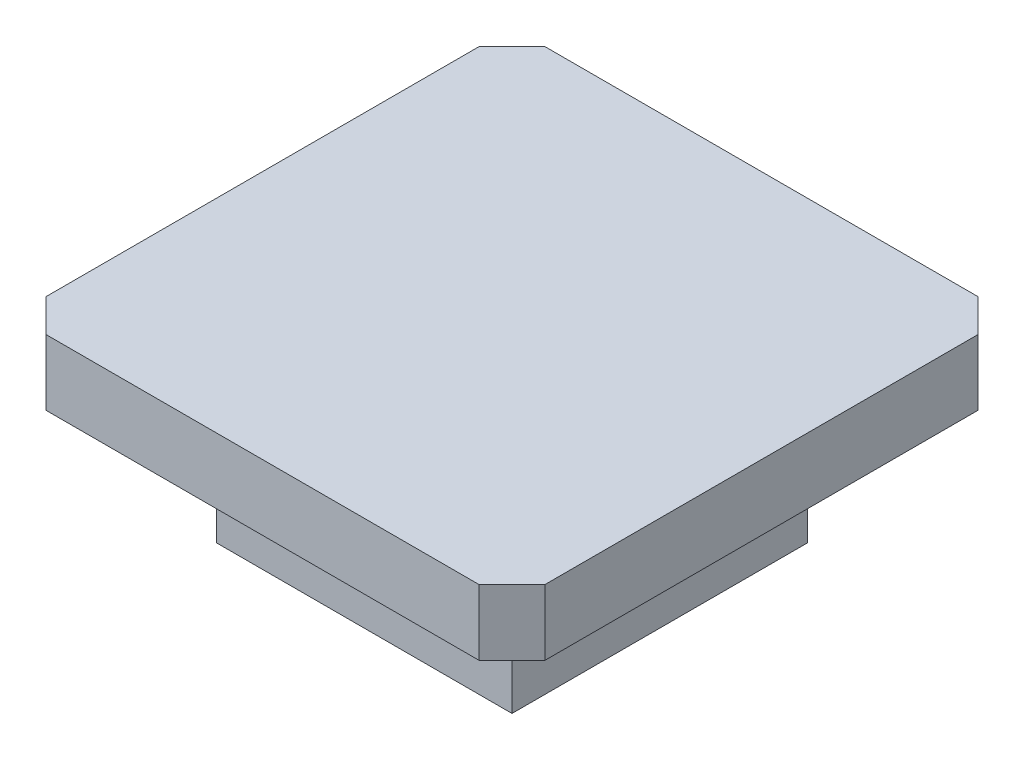
ISO-10303-21;
HEADER;
FILE_DESCRIPTION(('STEP AP214'),'2;1');
FILE_NAME('part.step','',(''),(''),'','','');
FILE_SCHEMA(('AUTOMOTIVE_DESIGN { 1 0 10303 214 1 1 1 1 }'));
ENDSEC;
DATA;
#1=APPLICATION_CONTEXT('core data for automotive mechanical design processes');
#2=APPLICATION_PROTOCOL_DEFINITION('international standard','automotive_design',2000,#1);
#3=PRODUCT_CONTEXT('',#1,'mechanical');
#4=PRODUCT('Part','Part','',(#3));
#5=PRODUCT_RELATED_PRODUCT_CATEGORY('part','',(#4));
#6=PRODUCT_DEFINITION_FORMATION('','',#4);
#7=PRODUCT_DEFINITION_CONTEXT('part definition',#1,'design');
#8=PRODUCT_DEFINITION('design','',#6,#7);
#9=PRODUCT_DEFINITION_SHAPE('','',#8);
#10=(LENGTH_UNIT() NAMED_UNIT(*) SI_UNIT(.MILLI.,.METRE.));
#11=(NAMED_UNIT(*) PLANE_ANGLE_UNIT() SI_UNIT($,.RADIAN.));
#12=(NAMED_UNIT(*) SI_UNIT($,.STERADIAN.) SOLID_ANGLE_UNIT());
#13=UNCERTAINTY_MEASURE_WITH_UNIT(LENGTH_MEASURE(1.E-05),#10,'distance_accuracy_value','');
#14=(GEOMETRIC_REPRESENTATION_CONTEXT(3) GLOBAL_UNCERTAINTY_ASSIGNED_CONTEXT((#13)) GLOBAL_UNIT_ASSIGNED_CONTEXT((#10,
#11,#12)) REPRESENTATION_CONTEXT('',''));
#15=CARTESIAN_POINT('',(0.,0.,0.));
#16=DIRECTION('',(0.,0.,1.));
#17=DIRECTION('',(1.,0.,0.));
#18=AXIS2_PLACEMENT_3D('',#15,#16,#17);
#19=CARTESIAN_POINT('',(0.,0.,0.));
#20=DIRECTION('',(0.,-1.,0.));
#21=DIRECTION('',(0.,0.,-1.));
#22=AXIS2_PLACEMENT_3D('',#19,#20,#21);
#23=PLANE('',#22);
#24=DIRECTION('',(0.,0.,1.));
#25=VECTOR('',#24,1.);
#26=CARTESIAN_POINT('',(8.25499999999988,0.,0.));
#27=LINE('',#26,#25);
#28=CARTESIAN_POINT('',(8.25499999999988,0.,-40.0050000000001));
#29=VERTEX_POINT('',#28);
#30=CARTESIAN_POINT('',(8.25499999999988,0.,-8.25500000000011));
#31=VERTEX_POINT('',#30);
#32=EDGE_CURVE('E228',#29,#31,#27,.T.);
#33=ORIENTED_EDGE('',*,*,#32,.T.);
#34=DIRECTION('',(1.,0.,0.));
#35=VECTOR('',#34,1.);
#36=CARTESIAN_POINT('',(0.,0.,-8.25500000000011));
#37=LINE('',#36,#35);
#38=CARTESIAN_POINT('',(40.0049999999999,0.,-8.25500000000011));
#39=VERTEX_POINT('',#38);
#40=EDGE_CURVE('E234',#31,#39,#37,.T.);
#41=ORIENTED_EDGE('',*,*,#40,.T.);
#42=DIRECTION('',(0.,0.,-1.));
#43=VECTOR('',#42,1.);
#44=CARTESIAN_POINT('',(40.0049999999999,0.,0.));
#45=LINE('',#44,#43);
#46=CARTESIAN_POINT('',(40.0049999999999,0.,-40.0050000000001));
#47=VERTEX_POINT('',#46);
#48=EDGE_CURVE('E232',#39,#47,#45,.T.);
#49=ORIENTED_EDGE('',*,*,#48,.T.);
#50=DIRECTION('',(-1.,0.,0.));
#51=VECTOR('',#50,1.);
#52=CARTESIAN_POINT('',(0.,0.,-40.0050000000001));
#53=LINE('',#52,#51);
#54=EDGE_CURVE('E230',#47,#29,#53,.T.);
#55=ORIENTED_EDGE('',*,*,#54,.T.);
#56=EDGE_LOOP('',(#33,#41,#49,#55));
#57=FACE_BOUND('',#56,.T.);
#58=DIRECTION('',(-1.,0.,0.));
#59=VECTOR('',#58,1.);
#60=CARTESIAN_POINT('',(0.,0.,-48.26));
#61=LINE('',#60,#59);
#62=CARTESIAN_POINT('',(45.085,0.,-48.26));
#63=VERTEX_POINT('',#62);
#64=CARTESIAN_POINT('',(3.175,0.,-48.26));
#65=VERTEX_POINT('',#64);
#66=EDGE_CURVE('E174',#63,#65,#61,.T.);
#67=ORIENTED_EDGE('',*,*,#66,.F.);
#68=DIRECTION('',(-0.707106781186545,0.,-0.70710678118655));
#69=VECTOR('',#68,1.);
#70=CARTESIAN_POINT('',(46.6725000000002,0.,-46.6724999999999));
#71=LINE('',#70,#69);
#72=CARTESIAN_POINT('',(48.26,0.,-45.085));
#73=VERTEX_POINT('',#72);
#74=EDGE_CURVE('E201',#63,#73,#71,.F.);
#75=ORIENTED_EDGE('',*,*,#74,.T.);
#76=DIRECTION('',(0.,0.,-1.));
#77=VECTOR('',#76,1.);
#78=CARTESIAN_POINT('',(48.26,0.,0.));
#79=LINE('',#78,#77);
#80=CARTESIAN_POINT('',(48.26,0.,-3.175));
#81=VERTEX_POINT('',#80);
#82=EDGE_CURVE('E186',#81,#73,#79,.T.);
#83=ORIENTED_EDGE('',*,*,#82,.F.);
#84=DIRECTION('',(0.707106781186549,0.,-0.707106781186546));
#85=VECTOR('',#84,1.);
#86=CARTESIAN_POINT('',(22.5424999999999,0.,22.5425));
#87=LINE('',#86,#85);
#88=CARTESIAN_POINT('',(45.085,0.,0.));
#89=VERTEX_POINT('',#88);
#90=EDGE_CURVE('E195',#81,#89,#87,.F.);
#91=ORIENTED_EDGE('',*,*,#90,.T.);
#92=DIRECTION('',(1.,0.,0.));
#93=VECTOR('',#92,1.);
#94=CARTESIAN_POINT('',(0.,0.,0.));
#95=LINE('',#94,#93);
#96=CARTESIAN_POINT('',(3.17500000000001,0.,0.));
#97=VERTEX_POINT('',#96);
#98=EDGE_CURVE('E164',#97,#89,#95,.T.);
#99=ORIENTED_EDGE('',*,*,#98,.F.);
#100=DIRECTION('',(0.707106781186546,0.,0.707106781186549));
#101=VECTOR('',#100,1.);
#102=CARTESIAN_POINT('',(1.58750000000001,0.,-1.5875));
#103=LINE('',#102,#101);
#104=CARTESIAN_POINT('',(0.,0.,-3.17500000000002));
#105=VERTEX_POINT('',#104);
#106=EDGE_CURVE('E197',#97,#105,#103,.F.);
#107=ORIENTED_EDGE('',*,*,#106,.T.);
#108=DIRECTION('',(0.,0.,1.));
#109=VECTOR('',#108,1.);
#110=CARTESIAN_POINT('',(0.,0.,0.));
#111=LINE('',#110,#109);
#112=CARTESIAN_POINT('',(0.,0.,-45.085));
#113=VERTEX_POINT('',#112);
#114=EDGE_CURVE('E161',#113,#105,#111,.T.);
#115=ORIENTED_EDGE('',*,*,#114,.F.);
#116=DIRECTION('',(-0.70710678118655,0.,0.707106781186545));
#117=VECTOR('',#116,1.);
#118=CARTESIAN_POINT('',(-22.5425,0.,-22.5425000000002));
#119=LINE('',#118,#117);
#120=EDGE_CURVE('E199',#113,#65,#119,.F.);
#121=ORIENTED_EDGE('',*,*,#120,.T.);
#122=EDGE_LOOP('',(#67,#75,#83,#91,#99,#107,#115,#121));
#123=FACE_BOUND('',#122,.T.);
#124=ADVANCED_FACE('F36',(#57,#123),#23,.T.);
#125=CARTESIAN_POINT('',(0.,6.35,0.));
#126=DIRECTION('',(1.,0.,0.));
#127=DIRECTION('',(0.,0.,-1.));
#128=AXIS2_PLACEMENT_3D('',#125,#126,#127);
#129=PLANE('',#128);
#130=DIRECTION('',(0.,0.,1.));
#131=VECTOR('',#130,1.);
#132=CARTESIAN_POINT('',(0.,6.35,0.));
#133=LINE('',#132,#131);
#134=CARTESIAN_POINT('',(0.,6.35,-45.085));
#135=VERTEX_POINT('',#134);
#136=CARTESIAN_POINT('',(0.,6.35,-3.17500000000002));
#137=VERTEX_POINT('',#136);
#138=EDGE_CURVE('E170',#135,#137,#133,.T.);
#139=ORIENTED_EDGE('',*,*,#138,.F.);
#140=DIRECTION('',(0.,-1.,0.));
#141=VECTOR('',#140,1.);
#142=CARTESIAN_POINT('',(0.,6.35,-45.085));
#143=LINE('',#142,#141);
#144=EDGE_CURVE('E218',#135,#113,#143,.T.);
#145=ORIENTED_EDGE('',*,*,#144,.T.);
#146=ORIENTED_EDGE('',*,*,#114,.T.);
#147=DIRECTION('',(0.,1.,0.));
#148=VECTOR('',#147,1.);
#149=CARTESIAN_POINT('',(0.,6.35,-3.17500000000002));
#150=LINE('',#149,#148);
#151=EDGE_CURVE('E216',#105,#137,#150,.T.);
#152=ORIENTED_EDGE('',*,*,#151,.T.);
#153=EDGE_LOOP('',(#139,#145,#146,#152));
#154=FACE_BOUND('',#153,.T.);
#155=ADVANCED_FACE('F277',(#154),#129,.F.);
#156=CARTESIAN_POINT('',(0.,6.35,0.));
#157=DIRECTION('',(0.,0.,-1.));
#158=DIRECTION('',(-1.,0.,0.));
#159=AXIS2_PLACEMENT_3D('',#156,#157,#158);
#160=PLANE('',#159);
#161=DIRECTION('',(1.,0.,0.));
#162=VECTOR('',#161,1.);
#163=CARTESIAN_POINT('',(0.,6.35,0.));
#164=LINE('',#163,#162);
#165=CARTESIAN_POINT('',(3.175,6.35,0.));
#166=VERTEX_POINT('',#165);
#167=CARTESIAN_POINT('',(45.085,6.35,0.));
#168=VERTEX_POINT('',#167);
#169=EDGE_CURVE('E173',#166,#168,#164,.T.);
#170=ORIENTED_EDGE('',*,*,#169,.F.);
#171=DIRECTION('',(0.,-1.,0.));
#172=VECTOR('',#171,1.);
#173=CARTESIAN_POINT('',(3.175,6.35,0.));
#174=LINE('',#173,#172);
#175=EDGE_CURVE('E223',#166,#97,#174,.T.);
#176=ORIENTED_EDGE('',*,*,#175,.T.);
#177=ORIENTED_EDGE('',*,*,#98,.T.);
#178=DIRECTION('',(0.,1.,0.));
#179=VECTOR('',#178,1.);
#180=CARTESIAN_POINT('',(45.085,6.35,0.));
#181=LINE('',#180,#179);
#182=EDGE_CURVE('E221',#89,#168,#181,.T.);
#183=ORIENTED_EDGE('',*,*,#182,.T.);
#184=EDGE_LOOP('',(#170,#176,#177,#183));
#185=FACE_BOUND('',#184,.T.);
#186=ADVANCED_FACE('F282',(#185),#160,.F.);
#187=CARTESIAN_POINT('',(48.26,6.35,0.));
#188=DIRECTION('',(-1.,0.,0.));
#189=DIRECTION('',(0.,0.,1.));
#190=AXIS2_PLACEMENT_3D('',#187,#188,#189);
#191=PLANE('',#190);
#192=ORIENTED_EDGE('',*,*,#82,.T.);
#193=DIRECTION('',(0.,1.,0.));
#194=VECTOR('',#193,1.);
#195=CARTESIAN_POINT('',(48.26,6.35,-45.085));
#196=LINE('',#195,#194);
#197=CARTESIAN_POINT('',(48.26,6.35,-45.085));
#198=VERTEX_POINT('',#197);
#199=EDGE_CURVE('E206',#73,#198,#196,.T.);
#200=ORIENTED_EDGE('',*,*,#199,.T.);
#201=DIRECTION('',(0.,0.,-1.));
#202=VECTOR('',#201,1.);
#203=CARTESIAN_POINT('',(48.26,6.35,0.));
#204=LINE('',#203,#202);
#205=CARTESIAN_POINT('',(48.26,6.35,-3.175));
#206=VERTEX_POINT('',#205);
#207=EDGE_CURVE('E177',#206,#198,#204,.T.);
#208=ORIENTED_EDGE('',*,*,#207,.F.);
#209=DIRECTION('',(0.,-1.,0.));
#210=VECTOR('',#209,1.);
#211=CARTESIAN_POINT('',(48.26,6.35,-3.175));
#212=LINE('',#211,#210);
#213=EDGE_CURVE('E203',#206,#81,#212,.T.);
#214=ORIENTED_EDGE('',*,*,#213,.T.);
#215=EDGE_LOOP('',(#192,#200,#208,#214));
#216=FACE_BOUND('',#215,.T.);
#217=ADVANCED_FACE('F292',(#216),#191,.F.);
#218=CARTESIAN_POINT('',(0.,6.35,-48.26));
#219=DIRECTION('',(0.,0.,1.));
#220=DIRECTION('',(1.,0.,0.));
#221=AXIS2_PLACEMENT_3D('',#218,#219,#220);
#222=PLANE('',#221);
#223=DIRECTION('',(-1.,0.,0.));
#224=VECTOR('',#223,1.);
#225=CARTESIAN_POINT('',(0.,6.35,-48.26));
#226=LINE('',#225,#224);
#227=CARTESIAN_POINT('',(45.085,6.35,-48.26));
#228=VERTEX_POINT('',#227);
#229=CARTESIAN_POINT('',(3.175,6.35,-48.26));
#230=VERTEX_POINT('',#229);
#231=EDGE_CURVE('E180',#228,#230,#226,.T.);
#232=ORIENTED_EDGE('',*,*,#231,.F.);
#233=DIRECTION('',(0.,-1.,0.));
#234=VECTOR('',#233,1.);
#235=CARTESIAN_POINT('',(45.085,6.35,-48.26));
#236=LINE('',#235,#234);
#237=EDGE_CURVE('E192',#228,#63,#236,.T.);
#238=ORIENTED_EDGE('',*,*,#237,.T.);
#239=ORIENTED_EDGE('',*,*,#66,.T.);
#240=DIRECTION('',(0.,1.,0.));
#241=VECTOR('',#240,1.);
#242=CARTESIAN_POINT('',(3.175,6.35,-48.26));
#243=LINE('',#242,#241);
#244=EDGE_CURVE('E182',#65,#230,#243,.T.);
#245=ORIENTED_EDGE('',*,*,#244,.T.);
#246=EDGE_LOOP('',(#232,#238,#239,#245));
#247=FACE_BOUND('',#246,.T.);
#248=ADVANCED_FACE('F289',(#247),#222,.F.);
#249=CARTESIAN_POINT('',(0.,6.35,0.));
#250=DIRECTION('',(0.,-1.,0.));
#251=DIRECTION('',(0.,0.,-1.));
#252=AXIS2_PLACEMENT_3D('',#249,#250,#251);
#253=PLANE('',#252);
#254=ORIENTED_EDGE('',*,*,#207,.T.);
#255=DIRECTION('',(0.707106781186545,0.,0.70710678118655));
#256=VECTOR('',#255,1.);
#257=CARTESIAN_POINT('',(45.085,6.35,-48.26));
#258=LINE('',#257,#256);
#259=EDGE_CURVE('E214',#198,#228,#258,.F.);
#260=ORIENTED_EDGE('',*,*,#259,.T.);
#261=ORIENTED_EDGE('',*,*,#231,.T.);
#262=DIRECTION('',(0.70710678118655,0.,-0.707106781186545));
#263=VECTOR('',#262,1.);
#264=CARTESIAN_POINT('',(0.,6.35,-45.085));
#265=LINE('',#264,#263);
#266=EDGE_CURVE('E212',#230,#135,#265,.F.);
#267=ORIENTED_EDGE('',*,*,#266,.T.);
#268=ORIENTED_EDGE('',*,*,#138,.T.);
#269=DIRECTION('',(-0.707106781186546,0.,-0.707106781186549));
#270=VECTOR('',#269,1.);
#271=CARTESIAN_POINT('',(3.175,6.35,0.));
#272=LINE('',#271,#270);
#273=EDGE_CURVE('E210',#137,#166,#272,.F.);
#274=ORIENTED_EDGE('',*,*,#273,.T.);
#275=ORIENTED_EDGE('',*,*,#169,.T.);
#276=DIRECTION('',(-0.707106781186549,0.,0.707106781186546));
#277=VECTOR('',#276,1.);
#278=CARTESIAN_POINT('',(48.26,6.35,-3.175));
#279=LINE('',#278,#277);
#280=EDGE_CURVE('E208',#168,#206,#279,.F.);
#281=ORIENTED_EDGE('',*,*,#280,.T.);
#282=EDGE_LOOP('',(#254,#260,#261,#267,#268,#274,#275,#281));
#283=FACE_BOUND('',#282,.T.);
#284=ADVANCED_FACE('F287',(#283),#253,.F.);
#285=CARTESIAN_POINT('',(45.085,6.35,-48.26));
#286=DIRECTION('',(-0.70710678118655,0.,0.707106781186545));
#287=DIRECTION('',(0.,-1.,0.));
#288=AXIS2_PLACEMENT_3D('',#285,#286,#287);
#289=PLANE('',#288);
#290=ORIENTED_EDGE('',*,*,#259,.F.);
#291=ORIENTED_EDGE('',*,*,#199,.F.);
#292=ORIENTED_EDGE('',*,*,#74,.F.);
#293=ORIENTED_EDGE('',*,*,#237,.F.);
#294=EDGE_LOOP('',(#290,#291,#292,#293));
#295=FACE_BOUND('',#294,.T.);
#296=ADVANCED_FACE('F300',(#295),#289,.F.);
#297=CARTESIAN_POINT('',(0.,6.35,-45.085));
#298=DIRECTION('',(0.707106781186545,0.,0.70710678118655));
#299=DIRECTION('',(0.,-1.,0.));
#300=AXIS2_PLACEMENT_3D('',#297,#298,#299);
#301=PLANE('',#300);
#302=ORIENTED_EDGE('',*,*,#266,.F.);
#303=ORIENTED_EDGE('',*,*,#244,.F.);
#304=ORIENTED_EDGE('',*,*,#120,.F.);
#305=ORIENTED_EDGE('',*,*,#144,.F.);
#306=EDGE_LOOP('',(#302,#303,#304,#305));
#307=FACE_BOUND('',#306,.T.);
#308=ADVANCED_FACE('F303',(#307),#301,.F.);
#309=CARTESIAN_POINT('',(3.175,6.35,0.));
#310=DIRECTION('',(0.707106781186549,0.,-0.707106781186546));
#311=DIRECTION('',(0.,-1.,0.));
#312=AXIS2_PLACEMENT_3D('',#309,#310,#311);
#313=PLANE('',#312);
#314=ORIENTED_EDGE('',*,*,#273,.F.);
#315=ORIENTED_EDGE('',*,*,#151,.F.);
#316=ORIENTED_EDGE('',*,*,#106,.F.);
#317=ORIENTED_EDGE('',*,*,#175,.F.);
#318=EDGE_LOOP('',(#314,#315,#316,#317));
#319=FACE_BOUND('',#318,.T.);
#320=ADVANCED_FACE('F307',(#319),#313,.F.);
#321=CARTESIAN_POINT('',(48.26,6.35,-3.175));
#322=DIRECTION('',(-0.707106781186546,0.,-0.707106781186549));
#323=DIRECTION('',(0.,-1.,0.));
#324=AXIS2_PLACEMENT_3D('',#321,#322,#323);
#325=PLANE('',#324);
#326=ORIENTED_EDGE('',*,*,#280,.F.);
#327=ORIENTED_EDGE('',*,*,#182,.F.);
#328=ORIENTED_EDGE('',*,*,#90,.F.);
#329=ORIENTED_EDGE('',*,*,#213,.F.);
#330=EDGE_LOOP('',(#326,#327,#328,#329));
#331=FACE_BOUND('',#330,.T.);
#332=ADVANCED_FACE('F311',(#331),#325,.F.);
#333=CARTESIAN_POINT('',(38.4174999999999,-12.7,-38.4175000000001));
#334=DIRECTION('',(-1.,0.,0.));
#335=DIRECTION('',(0.,0.,1.));
#336=AXIS2_PLACEMENT_3D('',#333,#334,#335);
#337=PLANE('',#336);
#338=DIRECTION('',(0.,1.,0.));
#339=VECTOR('',#338,1.);
#340=CARTESIAN_POINT('',(38.4174999999999,-12.7,-38.4175000000001));
#341=LINE('',#340,#339);
#342=CARTESIAN_POINT('',(38.4174999999999,-12.7,-38.4175000000001));
#343=VERTEX_POINT('',#342);
#344=CARTESIAN_POINT('',(38.4174999999999,-1.58750000000001,-38.4175000000001));
#345=VERTEX_POINT('',#344);
#346=EDGE_CURVE('E264',#343,#345,#341,.T.);
#347=ORIENTED_EDGE('',*,*,#346,.T.);
#348=DIRECTION('',(0.,0.,1.));
#349=VECTOR('',#348,1.);
#350=CARTESIAN_POINT('',(38.4174999999999,-1.58750000000001,-38.4175000000001));
#351=LINE('',#350,#349);
#352=CARTESIAN_POINT('',(38.4174999999999,-1.58750000000001,-9.84250000000011));
#353=VERTEX_POINT('',#352);
#354=EDGE_CURVE('E160',#345,#353,#351,.T.);
#355=ORIENTED_EDGE('',*,*,#354,.T.);
#356=DIRECTION('',(0.,1.,0.));
#357=VECTOR('',#356,1.);
#358=CARTESIAN_POINT('',(38.4174999999999,-12.7,-9.84250000000011));
#359=LINE('',#358,#357);
#360=CARTESIAN_POINT('',(38.4174999999999,-12.7,-9.84250000000011));
#361=VERTEX_POINT('',#360);
#362=EDGE_CURVE('E144',#361,#353,#359,.T.);
#363=ORIENTED_EDGE('',*,*,#362,.F.);
#364=DIRECTION('',(0.,0.,1.));
#365=VECTOR('',#364,1.);
#366=CARTESIAN_POINT('',(38.4174999999999,-12.7,-38.4175000000001));
#367=LINE('',#366,#365);
#368=EDGE_CURVE('E150',#343,#361,#367,.T.);
#369=ORIENTED_EDGE('',*,*,#368,.F.);
#370=EDGE_LOOP('',(#347,#355,#363,#369));
#371=FACE_BOUND('',#370,.T.);
#372=ADVANCED_FACE('F158',(#371),#337,.F.);
#373=CARTESIAN_POINT('',(9.84249999999988,-12.7,-9.84250000000011));
#374=DIRECTION('',(0.,0.,-1.));
#375=DIRECTION('',(-1.,0.,0.));
#376=AXIS2_PLACEMENT_3D('',#373,#374,#375);
#377=PLANE('',#376);
#378=ORIENTED_EDGE('',*,*,#362,.T.);
#379=DIRECTION('',(-1.,0.,0.));
#380=VECTOR('',#379,1.);
#381=CARTESIAN_POINT('',(9.84249999999988,-1.58750000000001,-9.84250000000011));
#382=LINE('',#381,#380);
#383=CARTESIAN_POINT('',(9.84249999999988,-1.58750000000001,-9.84250000000011));
#384=VERTEX_POINT('',#383);
#385=EDGE_CURVE('E226',#353,#384,#382,.T.);
#386=ORIENTED_EDGE('',*,*,#385,.T.);
#387=DIRECTION('',(0.,1.,0.));
#388=VECTOR('',#387,1.);
#389=CARTESIAN_POINT('',(9.84249999999988,-12.7,-9.84250000000011));
#390=LINE('',#389,#388);
#391=CARTESIAN_POINT('',(9.84249999999988,-12.7,-9.84250000000011));
#392=VERTEX_POINT('',#391);
#393=EDGE_CURVE('E146',#392,#384,#390,.T.);
#394=ORIENTED_EDGE('',*,*,#393,.F.);
#395=DIRECTION('',(-1.,0.,0.));
#396=VECTOR('',#395,1.);
#397=CARTESIAN_POINT('',(9.84249999999988,-12.7,-9.84250000000011));
#398=LINE('',#397,#396);
#399=EDGE_CURVE('E139',#361,#392,#398,.T.);
#400=ORIENTED_EDGE('',*,*,#399,.F.);
#401=EDGE_LOOP('',(#378,#386,#394,#400));
#402=FACE_BOUND('',#401,.T.);
#403=ADVANCED_FACE('F141',(#402),#377,.F.);
#404=CARTESIAN_POINT('',(9.84249999999988,-12.7,-38.4175000000001));
#405=DIRECTION('',(1.,0.,0.));
#406=DIRECTION('',(0.,0.,-1.));
#407=AXIS2_PLACEMENT_3D('',#404,#405,#406);
#408=PLANE('',#407);
#409=ORIENTED_EDGE('',*,*,#393,.T.);
#410=DIRECTION('',(0.,0.,-1.));
#411=VECTOR('',#410,1.);
#412=CARTESIAN_POINT('',(9.84249999999988,-1.58750000000001,-38.4175000000001));
#413=LINE('',#412,#411);
#414=CARTESIAN_POINT('',(9.84249999999988,-1.58750000000001,-38.4175000000001));
#415=VERTEX_POINT('',#414);
#416=EDGE_CURVE('E11',#384,#415,#413,.T.);
#417=ORIENTED_EDGE('',*,*,#416,.T.);
#418=DIRECTION('',(0.,1.,0.));
#419=VECTOR('',#418,1.);
#420=CARTESIAN_POINT('',(9.84249999999988,-12.7,-38.4175000000001));
#421=LINE('',#420,#419);
#422=CARTESIAN_POINT('',(9.84249999999988,-12.7,-38.4175000000001));
#423=VERTEX_POINT('',#422);
#424=EDGE_CURVE('E166',#423,#415,#421,.T.);
#425=ORIENTED_EDGE('',*,*,#424,.F.);
#426=DIRECTION('',(0.,0.,-1.));
#427=VECTOR('',#426,1.);
#428=CARTESIAN_POINT('',(9.84249999999988,-12.7,-38.4175000000001));
#429=LINE('',#428,#427);
#430=EDGE_CURVE('E149',#392,#423,#429,.T.);
#431=ORIENTED_EDGE('',*,*,#430,.F.);
#432=EDGE_LOOP('',(#409,#417,#425,#431));
#433=FACE_BOUND('',#432,.T.);
#434=ADVANCED_FACE('F262',(#433),#408,.F.);
#435=CARTESIAN_POINT('',(9.84249999999988,-12.7,-38.4175000000001));
#436=DIRECTION('',(0.,0.,1.));
#437=DIRECTION('',(1.,0.,0.));
#438=AXIS2_PLACEMENT_3D('',#435,#436,#437);
#439=PLANE('',#438);
#440=ORIENTED_EDGE('',*,*,#424,.T.);
#441=DIRECTION('',(1.,0.,0.));
#442=VECTOR('',#441,1.);
#443=CARTESIAN_POINT('',(9.84249999999988,-1.58750000000001,-38.4175000000001));
#444=LINE('',#443,#442);
#445=EDGE_CURVE('E45',#415,#345,#444,.T.);
#446=ORIENTED_EDGE('',*,*,#445,.T.);
#447=ORIENTED_EDGE('',*,*,#346,.F.);
#448=DIRECTION('',(1.,0.,0.));
#449=VECTOR('',#448,1.);
#450=CARTESIAN_POINT('',(9.84249999999988,-12.7,-38.4175000000001));
#451=LINE('',#450,#449);
#452=EDGE_CURVE('E155',#423,#343,#451,.T.);
#453=ORIENTED_EDGE('',*,*,#452,.F.);
#454=EDGE_LOOP('',(#440,#446,#447,#453));
#455=FACE_BOUND('',#454,.T.);
#456=ADVANCED_FACE('F267',(#455),#439,.F.);
#457=CARTESIAN_POINT('',(0.,-12.7,0.));
#458=DIRECTION('',(0.,1.,0.));
#459=DIRECTION('',(0.,0.,1.));
#460=AXIS2_PLACEMENT_3D('',#457,#458,#459);
#461=PLANE('',#460);
#462=ORIENTED_EDGE('',*,*,#368,.T.);
#463=ORIENTED_EDGE('',*,*,#399,.T.);
#464=ORIENTED_EDGE('',*,*,#430,.T.);
#465=ORIENTED_EDGE('',*,*,#452,.T.);
#466=EDGE_LOOP('',(#462,#463,#464,#465));
#467=FACE_BOUND('',#466,.T.);
#468=ADVANCED_FACE('F153',(#467),#461,.F.);
#469=CARTESIAN_POINT('',(9.84249999999988,-1.58750000000001,-38.4175000000001));
#470=DIRECTION('',(0.,0.707106781186544,0.707106781186551));
#471=DIRECTION('',(1.,0.,0.));
#472=AXIS2_PLACEMENT_3D('',#469,#470,#471);
#473=PLANE('',#472);
#474=DIRECTION('',(0.577350269189624,-0.577350269189629,0.577350269189624));
#475=VECTOR('',#474,1.);
#476=CARTESIAN_POINT('',(9.84249999999988,-1.58750000000001,-38.4175000000001));
#477=LINE('',#476,#475);
#478=EDGE_CURVE('E242',#29,#415,#477,.T.);
#479=ORIENTED_EDGE('',*,*,#478,.F.);
#480=ORIENTED_EDGE('',*,*,#54,.F.);
#481=DIRECTION('',(-0.577350269189624,-0.577350269189629,0.577350269189624));
#482=VECTOR('',#481,1.);
#483=CARTESIAN_POINT('',(28.8924999999999,-11.1125,-28.8925000000002));
#484=LINE('',#483,#482);
#485=EDGE_CURVE('E40',#345,#47,#484,.F.);
#486=ORIENTED_EDGE('',*,*,#485,.F.);
#487=ORIENTED_EDGE('',*,*,#445,.F.);
#488=EDGE_LOOP('',(#479,#480,#486,#487));
#489=FACE_BOUND('',#488,.T.);
#490=ADVANCED_FACE('F38',(#489),#473,.F.);
#491=CARTESIAN_POINT('',(38.4174999999999,-1.58750000000001,-38.4175000000001));
#492=DIRECTION('',(-0.707106781186551,0.707106781186544,0.));
#493=DIRECTION('',(0.,0.,1.));
#494=AXIS2_PLACEMENT_3D('',#491,#492,#493);
#495=PLANE('',#494);
#496=ORIENTED_EDGE('',*,*,#485,.T.);
#497=ORIENTED_EDGE('',*,*,#48,.F.);
#498=DIRECTION('',(-0.577350269189624,-0.577350269189629,-0.577350269189624));
#499=VECTOR('',#498,1.);
#500=CARTESIAN_POINT('',(28.8924999999999,-11.1125,-19.3675000000001));
#501=LINE('',#500,#499);
#502=EDGE_CURVE('E241',#353,#39,#501,.F.);
#503=ORIENTED_EDGE('',*,*,#502,.F.);
#504=ORIENTED_EDGE('',*,*,#354,.F.);
#505=EDGE_LOOP('',(#496,#497,#503,#504));
#506=FACE_BOUND('',#505,.T.);
#507=ADVANCED_FACE('F251',(#506),#495,.F.);
#508=CARTESIAN_POINT('',(9.84249999999988,-1.58750000000001,-38.4175000000001));
#509=DIRECTION('',(0.707106781186551,0.707106781186544,0.));
#510=DIRECTION('',(0.,0.,-1.));
#511=AXIS2_PLACEMENT_3D('',#508,#509,#510);
#512=PLANE('',#511);
#513=ORIENTED_EDGE('',*,*,#478,.T.);
#514=ORIENTED_EDGE('',*,*,#416,.F.);
#515=DIRECTION('',(-0.577350269189624,0.577350269189629,0.577350269189624));
#516=VECTOR('',#515,1.);
#517=CARTESIAN_POINT('',(19.3674999999998,-11.1125,-19.3675000000001));
#518=LINE('',#517,#516);
#519=EDGE_CURVE('E239',#31,#384,#518,.F.);
#520=ORIENTED_EDGE('',*,*,#519,.F.);
#521=ORIENTED_EDGE('',*,*,#32,.F.);
#522=EDGE_LOOP('',(#513,#514,#520,#521));
#523=FACE_BOUND('',#522,.T.);
#524=ADVANCED_FACE('F261',(#523),#512,.F.);
#525=CARTESIAN_POINT('',(9.84249999999988,-1.58750000000001,-9.84250000000011));
#526=DIRECTION('',(0.,0.707106781186544,-0.707106781186551));
#527=DIRECTION('',(-1.,0.,0.));
#528=AXIS2_PLACEMENT_3D('',#525,#526,#527);
#529=PLANE('',#528);
#530=ORIENTED_EDGE('',*,*,#502,.T.);
#531=ORIENTED_EDGE('',*,*,#40,.F.);
#532=ORIENTED_EDGE('',*,*,#519,.T.);
#533=ORIENTED_EDGE('',*,*,#385,.F.);
#534=EDGE_LOOP('',(#530,#531,#532,#533));
#535=FACE_BOUND('',#534,.T.);
#536=ADVANCED_FACE('F259',(#535),#529,.F.);
#537=CLOSED_SHELL('',(#124,#155,#186,#217,#248,#284,#296,#308,#320,#332,#372,#403,#434,#456,
#468,#490,#507,#524,#536));
#538=MANIFOLD_SOLID_BREP('B2',#537);
#539=ADVANCED_BREP_SHAPE_REPRESENTATION('',(#18,#538),#14);
#540=SHAPE_DEFINITION_REPRESENTATION(#9,#539);
ENDSEC;
END-ISO-10303-21;
